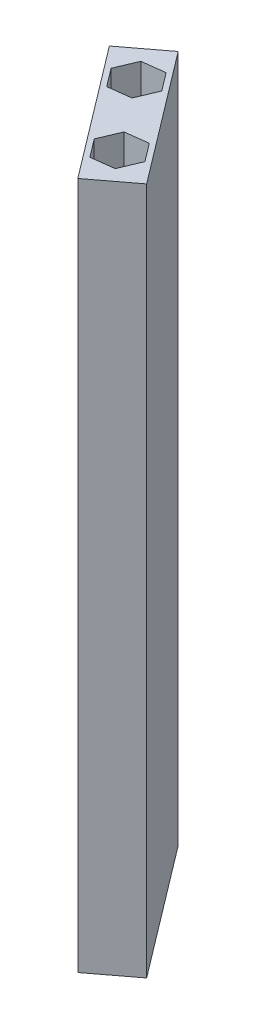
ISO-10303-21;
HEADER;
FILE_DESCRIPTION(('STEP AP214'),'2;1');
FILE_NAME('part.step','',(''),(''),'','','');
FILE_SCHEMA(('AUTOMOTIVE_DESIGN { 1 0 10303 214 1 1 1 1 }'));
ENDSEC;
DATA;
#1=APPLICATION_CONTEXT('core data for automotive mechanical design processes');
#2=APPLICATION_PROTOCOL_DEFINITION('international standard','automotive_design',2000,#1);
#3=PRODUCT_CONTEXT('',#1,'mechanical');
#4=PRODUCT('Part','Part','',(#3));
#5=PRODUCT_RELATED_PRODUCT_CATEGORY('part','',(#4));
#6=PRODUCT_DEFINITION_FORMATION('','',#4);
#7=PRODUCT_DEFINITION_CONTEXT('part definition',#1,'design');
#8=PRODUCT_DEFINITION('design','',#6,#7);
#9=PRODUCT_DEFINITION_SHAPE('','',#8);
#10=(LENGTH_UNIT() NAMED_UNIT(*) SI_UNIT(.MILLI.,.METRE.));
#11=(NAMED_UNIT(*) PLANE_ANGLE_UNIT() SI_UNIT($,.RADIAN.));
#12=(NAMED_UNIT(*) SI_UNIT($,.STERADIAN.) SOLID_ANGLE_UNIT());
#13=UNCERTAINTY_MEASURE_WITH_UNIT(LENGTH_MEASURE(1.E-05),#10,'distance_accuracy_value','');
#14=(GEOMETRIC_REPRESENTATION_CONTEXT(3) GLOBAL_UNCERTAINTY_ASSIGNED_CONTEXT((#13)) GLOBAL_UNIT_ASSIGNED_CONTEXT((#10,
#11,#12)) REPRESENTATION_CONTEXT('',''));
#15=CARTESIAN_POINT('',(0.,0.,0.));
#16=DIRECTION('',(0.,0.,1.));
#17=DIRECTION('',(1.,0.,0.));
#18=AXIS2_PLACEMENT_3D('',#15,#16,#17);
#19=CARTESIAN_POINT('',(0.,126.,0.));
#20=DIRECTION('',(0.,1.,0.));
#21=DIRECTION('',(0.,0.,1.));
#22=AXIS2_PLACEMENT_3D('',#19,#20,#21);
#23=PLANE('',#22);
#24=DIRECTION('',(-0.60421033242551,0.,-0.796824870464178));
#25=VECTOR('',#24,1.);
#26=CARTESIAN_POINT('',(70.2011458161671,126.,-136.477201188751));
#27=LINE('',#26,#25);
#28=CARTESIAN_POINT('',(70.2011458161671,126.,-136.477201188751));
#29=VERTEX_POINT('',#28);
#30=CARTESIAN_POINT('',(52.0748358434018,126.,-160.381947302676));
#31=VERTEX_POINT('',#30);
#32=EDGE_CURVE('E248',#29,#31,#27,.T.);
#33=ORIENTED_EDGE('',*,*,#32,.T.);
#34=DIRECTION('',(-0.796824870464177,0.,0.604210332425512));
#35=VECTOR('',#34,1.);
#36=CARTESIAN_POINT('',(52.0748358434018,126.,-160.381947302676));
#37=LINE('',#36,#35);
#38=CARTESIAN_POINT('',(44.9034120092242,126.,-154.944054310847));
#39=VERTEX_POINT('',#38);
#40=EDGE_CURVE('E251',#31,#39,#37,.T.);
#41=ORIENTED_EDGE('',*,*,#40,.T.);
#42=DIRECTION('',(0.60421033242551,0.,0.796824870464178));
#43=VECTOR('',#42,1.);
#44=CARTESIAN_POINT('',(44.9034120092242,126.,-154.944054310847));
#45=LINE('',#44,#43);
#46=CARTESIAN_POINT('',(63.0297219819895,126.,-131.039308196921));
#47=VERTEX_POINT('',#46);
#48=EDGE_CURVE('E254',#39,#47,#45,.T.);
#49=ORIENTED_EDGE('',*,*,#48,.T.);
#50=DIRECTION('',(0.796824870464176,0.,-0.604210332425513));
#51=VECTOR('',#50,1.);
#52=CARTESIAN_POINT('',(63.0297219819895,126.,-131.039308196921));
#53=LINE('',#52,#51);
#54=EDGE_CURVE('E256',#47,#29,#53,.T.);
#55=ORIENTED_EDGE('',*,*,#54,.T.);
#56=EDGE_LOOP('',(#33,#41,#49,#55));
#57=FACE_BOUND('',#56,.T.);
#58=DIRECTION('',(-0.99217574640198,0.,0.124849061877431));
#59=VECTOR('',#58,1.);
#60=CARTESIAN_POINT('',(54.3313381938997,126.,-155.916553302698));
#61=LINE('',#60,#59);
#62=CARTESIAN_POINT('',(54.3313381938997,126.,-155.916553302698));
#63=VERTEX_POINT('',#62);
#64=CARTESIAN_POINT('',(50.2069410671658,126.,-155.39756549842));
#65=VERTEX_POINT('',#64);
#66=EDGE_CURVE('E205',#63,#65,#61,.T.);
#67=ORIENTED_EDGE('',*,*,#66,.F.);
#68=DIRECTION('',(-0.604210332425505,0.,-0.796824870464182));
#69=VECTOR('',#68,1.);
#70=CARTESIAN_POINT('',(56.8429933800254,126.,-152.60421451779));
#71=LINE('',#70,#69);
#72=CARTESIAN_POINT('',(56.8429933800254,126.,-152.60421451779));
#73=VERTEX_POINT('',#72);
#74=EDGE_CURVE('E203',#73,#63,#71,.T.);
#75=ORIENTED_EDGE('',*,*,#74,.F.);
#76=DIRECTION('',(0.387965413976474,0.,-0.921673932341619));
#77=VECTOR('',#76,1.);
#78=CARTESIAN_POINT('',(55.2302514394172,126.,-148.772887928604));
#79=LINE('',#78,#77);
#80=CARTESIAN_POINT('',(55.2302514394172,126.,-148.772887928604));
#81=VERTEX_POINT('',#80);
#82=EDGE_CURVE('E215',#81,#73,#79,.T.);
#83=ORIENTED_EDGE('',*,*,#82,.F.);
#84=DIRECTION('',(0.992175746401979,0.,-0.124849061877435));
#85=VECTOR('',#84,1.);
#86=CARTESIAN_POINT('',(51.1058543126833,126.,-148.253900124326));
#87=LINE('',#86,#85);
#88=CARTESIAN_POINT('',(51.1058543126833,126.,-148.253900124326));
#89=VERTEX_POINT('',#88);
#90=EDGE_CURVE('E212',#89,#81,#87,.T.);
#91=ORIENTED_EDGE('',*,*,#90,.F.);
#92=DIRECTION('',(0.604210332425504,0.,0.796824870464183));
#93=VECTOR('',#92,1.);
#94=CARTESIAN_POINT('',(48.5941991265577,126.,-151.566238909234));
#95=LINE('',#94,#93);
#96=CARTESIAN_POINT('',(48.5941991265577,126.,-151.566238909234));
#97=VERTEX_POINT('',#96);
#98=EDGE_CURVE('E210',#97,#89,#95,.T.);
#99=ORIENTED_EDGE('',*,*,#98,.F.);
#100=DIRECTION('',(-0.387965413976475,0.,0.921673932341619));
#101=VECTOR('',#100,1.);
#102=CARTESIAN_POINT('',(50.2069410671658,126.,-155.39756549842));
#103=LINE('',#102,#101);
#104=EDGE_CURVE('E208',#65,#97,#103,.T.);
#105=ORIENTED_EDGE('',*,*,#104,.F.);
#106=EDGE_LOOP('',(#67,#75,#83,#91,#99,#105));
#107=FACE_BOUND('',#106,.T.);
#108=DIRECTION('',(-0.992175746401979,0.,0.124849061877432));
#109=VECTOR('',#108,1.);
#110=CARTESIAN_POINT('',(63.9987035127076,126.,-143.167355375271));
#111=LINE('',#110,#109);
#112=CARTESIAN_POINT('',(63.9987035127076,126.,-143.167355375271));
#113=VERTEX_POINT('',#112);
#114=CARTESIAN_POINT('',(59.874306385974,126.,-142.648367570994));
#115=VERTEX_POINT('',#114);
#116=EDGE_CURVE('E160',#113,#115,#111,.T.);
#117=ORIENTED_EDGE('',*,*,#116,.F.);
#118=DIRECTION('',(-0.604210332425513,0.,-0.796824870464176));
#119=VECTOR('',#118,1.);
#120=CARTESIAN_POINT('',(66.5103586988331,126.,-139.855016590363));
#121=LINE('',#120,#119);
#122=CARTESIAN_POINT('',(66.5103586988331,126.,-139.855016590363));
#123=VERTEX_POINT('',#122);
#124=EDGE_CURVE('E152',#123,#113,#121,.T.);
#125=ORIENTED_EDGE('',*,*,#124,.F.);
#126=DIRECTION('',(0.387965413976469,0.,-0.921673932341621));
#127=VECTOR('',#126,1.);
#128=CARTESIAN_POINT('',(64.8976167582251,126.,-136.023690001178));
#129=LINE('',#128,#127);
#130=CARTESIAN_POINT('',(64.8976167582251,126.,-136.023690001178));
#131=VERTEX_POINT('',#130);
#132=EDGE_CURVE('E181',#131,#123,#129,.T.);
#133=ORIENTED_EDGE('',*,*,#132,.F.);
#134=DIRECTION('',(0.992175746401979,0.,-0.124849061877439));
#135=VECTOR('',#134,1.);
#136=CARTESIAN_POINT('',(60.7732196314915,126.,-135.5047021969));
#137=LINE('',#136,#135);
#138=CARTESIAN_POINT('',(60.7732196314915,126.,-135.5047021969));
#139=VERTEX_POINT('',#138);
#140=EDGE_CURVE('E179',#139,#131,#137,.T.);
#141=ORIENTED_EDGE('',*,*,#140,.F.);
#142=DIRECTION('',(0.604210332425508,0.,0.79682487046418));
#143=VECTOR('',#142,1.);
#144=CARTESIAN_POINT('',(58.2615644453659,126.,-138.817040981808));
#145=LINE('',#144,#143);
#146=CARTESIAN_POINT('',(58.2615644453659,126.,-138.817040981808));
#147=VERTEX_POINT('',#146);
#148=EDGE_CURVE('E175',#147,#139,#145,.T.);
#149=ORIENTED_EDGE('',*,*,#148,.F.);
#150=DIRECTION('',(-0.387965413976475,0.,0.921673932341619));
#151=VECTOR('',#150,1.);
#152=CARTESIAN_POINT('',(59.874306385974,126.,-142.648367570994));
#153=LINE('',#152,#151);
#154=EDGE_CURVE('E173',#115,#147,#153,.T.);
#155=ORIENTED_EDGE('',*,*,#154,.F.);
#156=EDGE_LOOP('',(#117,#125,#133,#141,#149,#155));
#157=FACE_BOUND('',#156,.T.);
#158=ADVANCED_FACE('F39',(#57,#107,#157),#23,.T.);
#159=CARTESIAN_POINT('',(0.,0.,0.));
#160=DIRECTION('',(0.,1.,0.));
#161=DIRECTION('',(0.,0.,1.));
#162=AXIS2_PLACEMENT_3D('',#159,#160,#161);
#163=PLANE('',#162);
#164=DIRECTION('',(-0.604210332425505,0.,-0.796824870464182));
#165=VECTOR('',#164,1.);
#166=CARTESIAN_POINT('',(56.8429933800254,0.,-152.60421451779));
#167=LINE('',#166,#165);
#168=CARTESIAN_POINT('',(56.8429933800254,0.,-152.60421451779));
#169=VERTEX_POINT('',#168);
#170=CARTESIAN_POINT('',(54.3313381938997,0.,-155.916553302698));
#171=VERTEX_POINT('',#170);
#172=EDGE_CURVE('E168',#169,#171,#167,.T.);
#173=ORIENTED_EDGE('',*,*,#172,.T.);
#174=DIRECTION('',(-0.99217574640198,0.,0.124849061877431));
#175=VECTOR('',#174,1.);
#176=CARTESIAN_POINT('',(54.3313381938997,0.,-155.916553302698));
#177=LINE('',#176,#175);
#178=CARTESIAN_POINT('',(50.2069410671658,0.,-155.39756549842));
#179=VERTEX_POINT('',#178);
#180=EDGE_CURVE('E220',#171,#179,#177,.T.);
#181=ORIENTED_EDGE('',*,*,#180,.T.);
#182=DIRECTION('',(-0.387965413976475,0.,0.921673932341619));
#183=VECTOR('',#182,1.);
#184=CARTESIAN_POINT('',(50.2069410671658,0.,-155.39756549842));
#185=LINE('',#184,#183);
#186=CARTESIAN_POINT('',(48.5941991265577,0.,-151.566238909234));
#187=VERTEX_POINT('',#186);
#188=EDGE_CURVE('E223',#179,#187,#185,.T.);
#189=ORIENTED_EDGE('',*,*,#188,.T.);
#190=DIRECTION('',(0.604210332425504,0.,0.796824870464183));
#191=VECTOR('',#190,1.);
#192=CARTESIAN_POINT('',(48.5941991265577,0.,-151.566238909234));
#193=LINE('',#192,#191);
#194=CARTESIAN_POINT('',(51.1058543126833,0.,-148.253900124326));
#195=VERTEX_POINT('',#194);
#196=EDGE_CURVE('E226',#187,#195,#193,.T.);
#197=ORIENTED_EDGE('',*,*,#196,.T.);
#198=DIRECTION('',(0.992175746401979,0.,-0.124849061877435));
#199=VECTOR('',#198,1.);
#200=CARTESIAN_POINT('',(51.1058543126833,0.,-148.253900124326));
#201=LINE('',#200,#199);
#202=CARTESIAN_POINT('',(55.2302514394172,0.,-148.772887928604));
#203=VERTEX_POINT('',#202);
#204=EDGE_CURVE('E229',#195,#203,#201,.T.);
#205=ORIENTED_EDGE('',*,*,#204,.T.);
#206=DIRECTION('',(0.387965413976474,0.,-0.921673932341619));
#207=VECTOR('',#206,1.);
#208=CARTESIAN_POINT('',(55.2302514394172,0.,-148.772887928604));
#209=LINE('',#208,#207);
#210=EDGE_CURVE('E206',#203,#169,#209,.T.);
#211=ORIENTED_EDGE('',*,*,#210,.T.);
#212=EDGE_LOOP('',(#173,#181,#189,#197,#205,#211));
#213=FACE_BOUND('',#212,.T.);
#214=DIRECTION('',(-0.60421033242551,0.,-0.796824870464178));
#215=VECTOR('',#214,1.);
#216=CARTESIAN_POINT('',(70.2011458161671,0.,-136.477201188751));
#217=LINE('',#216,#215);
#218=CARTESIAN_POINT('',(70.2011458161671,0.,-136.477201188751));
#219=VERTEX_POINT('',#218);
#220=CARTESIAN_POINT('',(52.0748358434018,0.,-160.381947302676));
#221=VERTEX_POINT('',#220);
#222=EDGE_CURVE('E247',#219,#221,#217,.T.);
#223=ORIENTED_EDGE('',*,*,#222,.F.);
#224=DIRECTION('',(0.796824870464176,0.,-0.604210332425513));
#225=VECTOR('',#224,1.);
#226=CARTESIAN_POINT('',(63.0297219819895,0.,-131.039308196921));
#227=LINE('',#226,#225);
#228=CARTESIAN_POINT('',(63.0297219819895,0.,-131.039308196921));
#229=VERTEX_POINT('',#228);
#230=EDGE_CURVE('E252',#229,#219,#227,.T.);
#231=ORIENTED_EDGE('',*,*,#230,.F.);
#232=DIRECTION('',(0.60421033242551,0.,0.796824870464178));
#233=VECTOR('',#232,1.);
#234=CARTESIAN_POINT('',(44.9034120092242,0.,-154.944054310847));
#235=LINE('',#234,#233);
#236=CARTESIAN_POINT('',(44.9034120092242,0.,-154.944054310847));
#237=VERTEX_POINT('',#236);
#238=EDGE_CURVE('E263',#237,#229,#235,.T.);
#239=ORIENTED_EDGE('',*,*,#238,.F.);
#240=DIRECTION('',(-0.796824870464177,0.,0.604210332425512));
#241=VECTOR('',#240,1.);
#242=CARTESIAN_POINT('',(52.0748358434018,0.,-160.381947302676));
#243=LINE('',#242,#241);
#244=EDGE_CURVE('E261',#221,#237,#243,.T.);
#245=ORIENTED_EDGE('',*,*,#244,.F.);
#246=EDGE_LOOP('',(#223,#231,#239,#245));
#247=FACE_BOUND('',#246,.T.);
#248=DIRECTION('',(-0.604210332425513,0.,-0.796824870464176));
#249=VECTOR('',#248,1.);
#250=CARTESIAN_POINT('',(66.5103586988331,0.,-139.855016590363));
#251=LINE('',#250,#249);
#252=CARTESIAN_POINT('',(66.5103586988331,0.,-139.855016590363));
#253=VERTEX_POINT('',#252);
#254=CARTESIAN_POINT('',(63.9987035127076,0.,-143.167355375271));
#255=VERTEX_POINT('',#254);
#256=EDGE_CURVE('E62',#253,#255,#251,.T.);
#257=ORIENTED_EDGE('',*,*,#256,.T.);
#258=DIRECTION('',(-0.992175746401979,0.,0.124849061877432));
#259=VECTOR('',#258,1.);
#260=CARTESIAN_POINT('',(63.9987035127076,0.,-143.167355375271));
#261=LINE('',#260,#259);
#262=CARTESIAN_POINT('',(59.874306385974,0.,-142.648367570994));
#263=VERTEX_POINT('',#262);
#264=EDGE_CURVE('E167',#255,#263,#261,.T.);
#265=ORIENTED_EDGE('',*,*,#264,.T.);
#266=DIRECTION('',(-0.387965413976475,0.,0.921673932341619));
#267=VECTOR('',#266,1.);
#268=CARTESIAN_POINT('',(59.874306385974,0.,-142.648367570994));
#269=LINE('',#268,#267);
#270=CARTESIAN_POINT('',(58.2615644453659,0.,-138.817040981808));
#271=VERTEX_POINT('',#270);
#272=EDGE_CURVE('E185',#263,#271,#269,.T.);
#273=ORIENTED_EDGE('',*,*,#272,.T.);
#274=DIRECTION('',(0.604210332425508,0.,0.79682487046418));
#275=VECTOR('',#274,1.);
#276=CARTESIAN_POINT('',(58.2615644453659,0.,-138.817040981808));
#277=LINE('',#276,#275);
#278=CARTESIAN_POINT('',(60.7732196314915,0.,-135.5047021969));
#279=VERTEX_POINT('',#278);
#280=EDGE_CURVE('E188',#271,#279,#277,.T.);
#281=ORIENTED_EDGE('',*,*,#280,.T.);
#282=DIRECTION('',(0.992175746401979,0.,-0.124849061877439));
#283=VECTOR('',#282,1.);
#284=CARTESIAN_POINT('',(60.7732196314915,0.,-135.5047021969));
#285=LINE('',#284,#283);
#286=CARTESIAN_POINT('',(64.8976167582251,0.,-136.023690001178));
#287=VERTEX_POINT('',#286);
#288=EDGE_CURVE('E191',#279,#287,#285,.T.);
#289=ORIENTED_EDGE('',*,*,#288,.T.);
#290=DIRECTION('',(0.387965413976469,0.,-0.921673932341621));
#291=VECTOR('',#290,1.);
#292=CARTESIAN_POINT('',(64.8976167582251,0.,-136.023690001178));
#293=LINE('',#292,#291);
#294=EDGE_CURVE('E161',#287,#253,#293,.T.);
#295=ORIENTED_EDGE('',*,*,#294,.T.);
#296=EDGE_LOOP('',(#257,#265,#273,#281,#289,#295));
#297=FACE_BOUND('',#296,.T.);
#298=ADVANCED_FACE('F281',(#213,#247,#297),#163,.F.);
#299=CARTESIAN_POINT('',(70.2011458161671,126.,-136.477201188751));
#300=DIRECTION('',(-0.796824870464178,0.,0.60421033242551));
#301=DIRECTION('',(0.60421033242551,0.,0.796824870464178));
#302=AXIS2_PLACEMENT_3D('',#299,#300,#301);
#303=PLANE('',#302);
#304=ORIENTED_EDGE('',*,*,#222,.T.);
#305=DIRECTION('',(0.,-1.,0.));
#306=VECTOR('',#305,1.);
#307=CARTESIAN_POINT('',(52.0748358434018,126.,-160.381947302676));
#308=LINE('',#307,#306);
#309=EDGE_CURVE('E11',#31,#221,#308,.T.);
#310=ORIENTED_EDGE('',*,*,#309,.F.);
#311=ORIENTED_EDGE('',*,*,#32,.F.);
#312=DIRECTION('',(0.,-1.,0.));
#313=VECTOR('',#312,1.);
#314=CARTESIAN_POINT('',(70.2011458161671,126.,-136.477201188751));
#315=LINE('',#314,#313);
#316=EDGE_CURVE('E258',#29,#219,#315,.T.);
#317=ORIENTED_EDGE('',*,*,#316,.T.);
#318=EDGE_LOOP('',(#304,#310,#311,#317));
#319=FACE_BOUND('',#318,.T.);
#320=ADVANCED_FACE('F41',(#319),#303,.F.);
#321=CARTESIAN_POINT('',(52.0748358434018,126.,-160.381947302676));
#322=DIRECTION('',(0.604210332425512,0.,0.796824870464177));
#323=DIRECTION('',(0.796824870464177,0.,-0.604210332425512));
#324=AXIS2_PLACEMENT_3D('',#321,#322,#323);
#325=PLANE('',#324);
#326=ORIENTED_EDGE('',*,*,#244,.T.);
#327=DIRECTION('',(0.,-1.,0.));
#328=VECTOR('',#327,1.);
#329=CARTESIAN_POINT('',(44.9034120092242,126.,-154.944054310847));
#330=LINE('',#329,#328);
#331=EDGE_CURVE('E47',#39,#237,#330,.T.);
#332=ORIENTED_EDGE('',*,*,#331,.F.);
#333=ORIENTED_EDGE('',*,*,#40,.F.);
#334=ORIENTED_EDGE('',*,*,#309,.T.);
#335=EDGE_LOOP('',(#326,#332,#333,#334));
#336=FACE_BOUND('',#335,.T.);
#337=ADVANCED_FACE('F292',(#336),#325,.F.);
#338=CARTESIAN_POINT('',(44.9034120092242,126.,-154.944054310847));
#339=DIRECTION('',(0.796824870464178,0.,-0.60421033242551));
#340=DIRECTION('',(-0.60421033242551,0.,-0.796824870464178));
#341=AXIS2_PLACEMENT_3D('',#338,#339,#340);
#342=PLANE('',#341);
#343=ORIENTED_EDGE('',*,*,#238,.T.);
#344=DIRECTION('',(0.,-1.,0.));
#345=VECTOR('',#344,1.);
#346=CARTESIAN_POINT('',(63.0297219819895,126.,-131.039308196921));
#347=LINE('',#346,#345);
#348=EDGE_CURVE('E268',#47,#229,#347,.T.);
#349=ORIENTED_EDGE('',*,*,#348,.F.);
#350=ORIENTED_EDGE('',*,*,#48,.F.);
#351=ORIENTED_EDGE('',*,*,#331,.T.);
#352=EDGE_LOOP('',(#343,#349,#350,#351));
#353=FACE_BOUND('',#352,.T.);
#354=ADVANCED_FACE('F275',(#353),#342,.F.);
#355=CARTESIAN_POINT('',(63.0297219819895,126.,-131.039308196921));
#356=DIRECTION('',(-0.604210332425513,0.,-0.796824870464176));
#357=DIRECTION('',(-0.796824870464176,0.,0.604210332425513));
#358=AXIS2_PLACEMENT_3D('',#355,#356,#357);
#359=PLANE('',#358);
#360=ORIENTED_EDGE('',*,*,#230,.T.);
#361=ORIENTED_EDGE('',*,*,#316,.F.);
#362=ORIENTED_EDGE('',*,*,#54,.F.);
#363=ORIENTED_EDGE('',*,*,#348,.T.);
#364=EDGE_LOOP('',(#360,#361,#362,#363));
#365=FACE_BOUND('',#364,.T.);
#366=ADVANCED_FACE('F285',(#365),#359,.F.);
#367=CARTESIAN_POINT('',(56.8429933800254,126.,-152.60421451779));
#368=DIRECTION('',(-0.796824870464182,0.,0.604210332425506));
#369=DIRECTION('',(0.604210332425505,0.,0.796824870464182));
#370=AXIS2_PLACEMENT_3D('',#367,#368,#369);
#371=PLANE('',#370);
#372=ORIENTED_EDGE('',*,*,#172,.F.);
#373=DIRECTION('',(0.,-1.,0.));
#374=VECTOR('',#373,1.);
#375=CARTESIAN_POINT('',(56.8429933800254,126.,-152.60421451779));
#376=LINE('',#375,#374);
#377=EDGE_CURVE('E217',#73,#169,#376,.T.);
#378=ORIENTED_EDGE('',*,*,#377,.F.);
#379=ORIENTED_EDGE('',*,*,#74,.T.);
#380=DIRECTION('',(0.,-1.,0.));
#381=VECTOR('',#380,1.);
#382=CARTESIAN_POINT('',(54.3313381938997,126.,-155.916553302698));
#383=LINE('',#382,#381);
#384=EDGE_CURVE('E244',#63,#171,#383,.T.);
#385=ORIENTED_EDGE('',*,*,#384,.T.);
#386=EDGE_LOOP('',(#372,#378,#379,#385));
#387=FACE_BOUND('',#386,.T.);
#388=ADVANCED_FACE('F307',(#387),#371,.T.);
#389=CARTESIAN_POINT('',(54.3313381938997,126.,-155.916553302698));
#390=DIRECTION('',(0.124849061877431,0.,0.99217574640198));
#391=DIRECTION('',(0.99217574640198,0.,-0.124849061877431));
#392=AXIS2_PLACEMENT_3D('',#389,#390,#391);
#393=PLANE('',#392);
#394=ORIENTED_EDGE('',*,*,#180,.F.);
#395=ORIENTED_EDGE('',*,*,#384,.F.);
#396=ORIENTED_EDGE('',*,*,#66,.T.);
#397=DIRECTION('',(0.,-1.,0.));
#398=VECTOR('',#397,1.);
#399=CARTESIAN_POINT('',(50.2069410671658,126.,-155.39756549842));
#400=LINE('',#399,#398);
#401=EDGE_CURVE('E242',#65,#179,#400,.T.);
#402=ORIENTED_EDGE('',*,*,#401,.T.);
#403=EDGE_LOOP('',(#394,#395,#396,#402));
#404=FACE_BOUND('',#403,.T.);
#405=ADVANCED_FACE('F314',(#404),#393,.T.);
#406=CARTESIAN_POINT('',(50.2069410671658,126.,-155.39756549842));
#407=DIRECTION('',(0.921673932341619,0.,0.387965413976475));
#408=DIRECTION('',(0.387965413976475,0.,-0.921673932341619));
#409=AXIS2_PLACEMENT_3D('',#406,#407,#408);
#410=PLANE('',#409);
#411=ORIENTED_EDGE('',*,*,#188,.F.);
#412=ORIENTED_EDGE('',*,*,#401,.F.);
#413=ORIENTED_EDGE('',*,*,#104,.T.);
#414=DIRECTION('',(0.,-1.,0.));
#415=VECTOR('',#414,1.);
#416=CARTESIAN_POINT('',(48.5941991265577,126.,-151.566238909234));
#417=LINE('',#416,#415);
#418=EDGE_CURVE('E240',#97,#187,#417,.T.);
#419=ORIENTED_EDGE('',*,*,#418,.T.);
#420=EDGE_LOOP('',(#411,#412,#413,#419));
#421=FACE_BOUND('',#420,.T.);
#422=ADVANCED_FACE('F319',(#421),#410,.T.);
#423=CARTESIAN_POINT('',(48.5941991265577,126.,-151.566238909234));
#424=DIRECTION('',(0.796824870464183,0.,-0.604210332425504));
#425=DIRECTION('',(-0.604210332425504,0.,-0.796824870464183));
#426=AXIS2_PLACEMENT_3D('',#423,#424,#425);
#427=PLANE('',#426);
#428=ORIENTED_EDGE('',*,*,#196,.F.);
#429=ORIENTED_EDGE('',*,*,#418,.F.);
#430=ORIENTED_EDGE('',*,*,#98,.T.);
#431=DIRECTION('',(0.,-1.,0.));
#432=VECTOR('',#431,1.);
#433=CARTESIAN_POINT('',(51.1058543126833,126.,-148.253900124326));
#434=LINE('',#433,#432);
#435=EDGE_CURVE('E238',#89,#195,#434,.T.);
#436=ORIENTED_EDGE('',*,*,#435,.T.);
#437=EDGE_LOOP('',(#428,#429,#430,#436));
#438=FACE_BOUND('',#437,.T.);
#439=ADVANCED_FACE('F342',(#438),#427,.T.);
#440=CARTESIAN_POINT('',(51.1058543126833,126.,-148.253900124326));
#441=DIRECTION('',(-0.124849061877435,0.,-0.992175746401979));
#442=DIRECTION('',(-0.992175746401979,0.,0.124849061877435));
#443=AXIS2_PLACEMENT_3D('',#440,#441,#442);
#444=PLANE('',#443);
#445=ORIENTED_EDGE('',*,*,#204,.F.);
#446=ORIENTED_EDGE('',*,*,#435,.F.);
#447=ORIENTED_EDGE('',*,*,#90,.T.);
#448=DIRECTION('',(0.,-1.,0.));
#449=VECTOR('',#448,1.);
#450=CARTESIAN_POINT('',(55.2302514394172,126.,-148.772887928604));
#451=LINE('',#450,#449);
#452=EDGE_CURVE('E236',#81,#203,#451,.T.);
#453=ORIENTED_EDGE('',*,*,#452,.T.);
#454=EDGE_LOOP('',(#445,#446,#447,#453));
#455=FACE_BOUND('',#454,.T.);
#456=ADVANCED_FACE('F332',(#455),#444,.T.);
#457=CARTESIAN_POINT('',(55.2302514394172,126.,-148.772887928604));
#458=DIRECTION('',(-0.921673932341619,0.,-0.387965413976474));
#459=DIRECTION('',(-0.387965413976474,0.,0.921673932341619));
#460=AXIS2_PLACEMENT_3D('',#457,#458,#459);
#461=PLANE('',#460);
#462=ORIENTED_EDGE('',*,*,#210,.F.);
#463=ORIENTED_EDGE('',*,*,#452,.F.);
#464=ORIENTED_EDGE('',*,*,#82,.T.);
#465=ORIENTED_EDGE('',*,*,#377,.T.);
#466=EDGE_LOOP('',(#462,#463,#464,#465));
#467=FACE_BOUND('',#466,.T.);
#468=ADVANCED_FACE('F326',(#467),#461,.T.);
#469=CARTESIAN_POINT('',(66.5103586988331,126.,-139.855016590363));
#470=DIRECTION('',(-0.796824870464176,0.,0.604210332425513));
#471=DIRECTION('',(0.604210332425513,0.,0.796824870464176));
#472=AXIS2_PLACEMENT_3D('',#469,#470,#471);
#473=PLANE('',#472);
#474=ORIENTED_EDGE('',*,*,#256,.F.);
#475=DIRECTION('',(0.,-1.,0.));
#476=VECTOR('',#475,1.);
#477=CARTESIAN_POINT('',(66.5103586988331,126.,-139.855016590363));
#478=LINE('',#477,#476);
#479=EDGE_CURVE('E156',#123,#253,#478,.T.);
#480=ORIENTED_EDGE('',*,*,#479,.F.);
#481=ORIENTED_EDGE('',*,*,#124,.T.);
#482=DIRECTION('',(0.,-1.,0.));
#483=VECTOR('',#482,1.);
#484=CARTESIAN_POINT('',(63.9987035127076,126.,-143.167355375271));
#485=LINE('',#484,#483);
#486=EDGE_CURVE('E155',#113,#255,#485,.T.);
#487=ORIENTED_EDGE('',*,*,#486,.T.);
#488=EDGE_LOOP('',(#474,#480,#481,#487));
#489=FACE_BOUND('',#488,.T.);
#490=ADVANCED_FACE('F154',(#489),#473,.T.);
#491=CARTESIAN_POINT('',(63.9987035127076,126.,-143.167355375271));
#492=DIRECTION('',(0.124849061877432,0.,0.992175746401979));
#493=DIRECTION('',(0.99217574640198,0.,-0.124849061877432));
#494=AXIS2_PLACEMENT_3D('',#491,#492,#493);
#495=PLANE('',#494);
#496=ORIENTED_EDGE('',*,*,#264,.F.);
#497=ORIENTED_EDGE('',*,*,#486,.F.);
#498=ORIENTED_EDGE('',*,*,#116,.T.);
#499=DIRECTION('',(0.,-1.,0.));
#500=VECTOR('',#499,1.);
#501=CARTESIAN_POINT('',(59.874306385974,126.,-142.648367570994));
#502=LINE('',#501,#500);
#503=EDGE_CURVE('E169',#115,#263,#502,.T.);
#504=ORIENTED_EDGE('',*,*,#503,.T.);
#505=EDGE_LOOP('',(#496,#497,#498,#504));
#506=FACE_BOUND('',#505,.T.);
#507=ADVANCED_FACE('F164',(#506),#495,.T.);
#508=CARTESIAN_POINT('',(59.874306385974,126.,-142.648367570994));
#509=DIRECTION('',(0.921673932341619,0.,0.387965413976475));
#510=DIRECTION('',(0.387965413976475,0.,-0.921673932341619));
#511=AXIS2_PLACEMENT_3D('',#508,#509,#510);
#512=PLANE('',#511);
#513=ORIENTED_EDGE('',*,*,#272,.F.);
#514=ORIENTED_EDGE('',*,*,#503,.F.);
#515=ORIENTED_EDGE('',*,*,#154,.T.);
#516=DIRECTION('',(0.,-1.,0.));
#517=VECTOR('',#516,1.);
#518=CARTESIAN_POINT('',(58.2615644453659,126.,-138.817040981808));
#519=LINE('',#518,#517);
#520=EDGE_CURVE('E200',#147,#271,#519,.T.);
#521=ORIENTED_EDGE('',*,*,#520,.T.);
#522=EDGE_LOOP('',(#513,#514,#515,#521));
#523=FACE_BOUND('',#522,.T.);
#524=ADVANCED_FACE('F358',(#523),#512,.T.);
#525=CARTESIAN_POINT('',(58.2615644453659,126.,-138.817040981808));
#526=DIRECTION('',(0.79682487046418,0.,-0.604210332425508));
#527=DIRECTION('',(-0.604210332425508,0.,-0.79682487046418));
#528=AXIS2_PLACEMENT_3D('',#525,#526,#527);
#529=PLANE('',#528);
#530=ORIENTED_EDGE('',*,*,#280,.F.);
#531=ORIENTED_EDGE('',*,*,#520,.F.);
#532=ORIENTED_EDGE('',*,*,#148,.T.);
#533=DIRECTION('',(0.,-1.,0.));
#534=VECTOR('',#533,1.);
#535=CARTESIAN_POINT('',(60.7732196314915,126.,-135.5047021969));
#536=LINE('',#535,#534);
#537=EDGE_CURVE('E198',#139,#279,#536,.T.);
#538=ORIENTED_EDGE('',*,*,#537,.T.);
#539=EDGE_LOOP('',(#530,#531,#532,#538));
#540=FACE_BOUND('',#539,.T.);
#541=ADVANCED_FACE('F361',(#540),#529,.T.);
#542=CARTESIAN_POINT('',(60.7732196314915,126.,-135.5047021969));
#543=DIRECTION('',(-0.124849061877439,0.,-0.992175746401979));
#544=DIRECTION('',(-0.992175746401979,0.,0.124849061877439));
#545=AXIS2_PLACEMENT_3D('',#542,#543,#544);
#546=PLANE('',#545);
#547=ORIENTED_EDGE('',*,*,#288,.F.);
#548=ORIENTED_EDGE('',*,*,#537,.F.);
#549=ORIENTED_EDGE('',*,*,#140,.T.);
#550=DIRECTION('',(0.,-1.,0.));
#551=VECTOR('',#550,1.);
#552=CARTESIAN_POINT('',(64.8976167582251,126.,-136.023690001178));
#553=LINE('',#552,#551);
#554=EDGE_CURVE('E54',#131,#287,#553,.T.);
#555=ORIENTED_EDGE('',*,*,#554,.T.);
#556=EDGE_LOOP('',(#547,#548,#549,#555));
#557=FACE_BOUND('',#556,.T.);
#558=ADVANCED_FACE('F365',(#557),#546,.T.);
#559=CARTESIAN_POINT('',(64.8976167582251,126.,-136.023690001178));
#560=DIRECTION('',(-0.921673932341621,0.,-0.387965413976469));
#561=DIRECTION('',(-0.387965413976469,0.,0.921673932341621));
#562=AXIS2_PLACEMENT_3D('',#559,#560,#561);
#563=PLANE('',#562);
#564=ORIENTED_EDGE('',*,*,#294,.F.);
#565=ORIENTED_EDGE('',*,*,#554,.F.);
#566=ORIENTED_EDGE('',*,*,#132,.T.);
#567=ORIENTED_EDGE('',*,*,#479,.T.);
#568=EDGE_LOOP('',(#564,#565,#566,#567));
#569=FACE_BOUND('',#568,.T.);
#570=ADVANCED_FACE('F369',(#569),#563,.T.);
#571=CLOSED_SHELL('',(#158,#298,#320,#337,#354,#366,#388,#405,#422,#439,#456,#468,#490,#507,
#524,#541,#558,#570));
#572=MANIFOLD_SOLID_BREP('B2',#571);
#573=ADVANCED_BREP_SHAPE_REPRESENTATION('',(#18,#572),#14);
#574=SHAPE_DEFINITION_REPRESENTATION(#9,#573);
ENDSEC;
END-ISO-10303-21;
